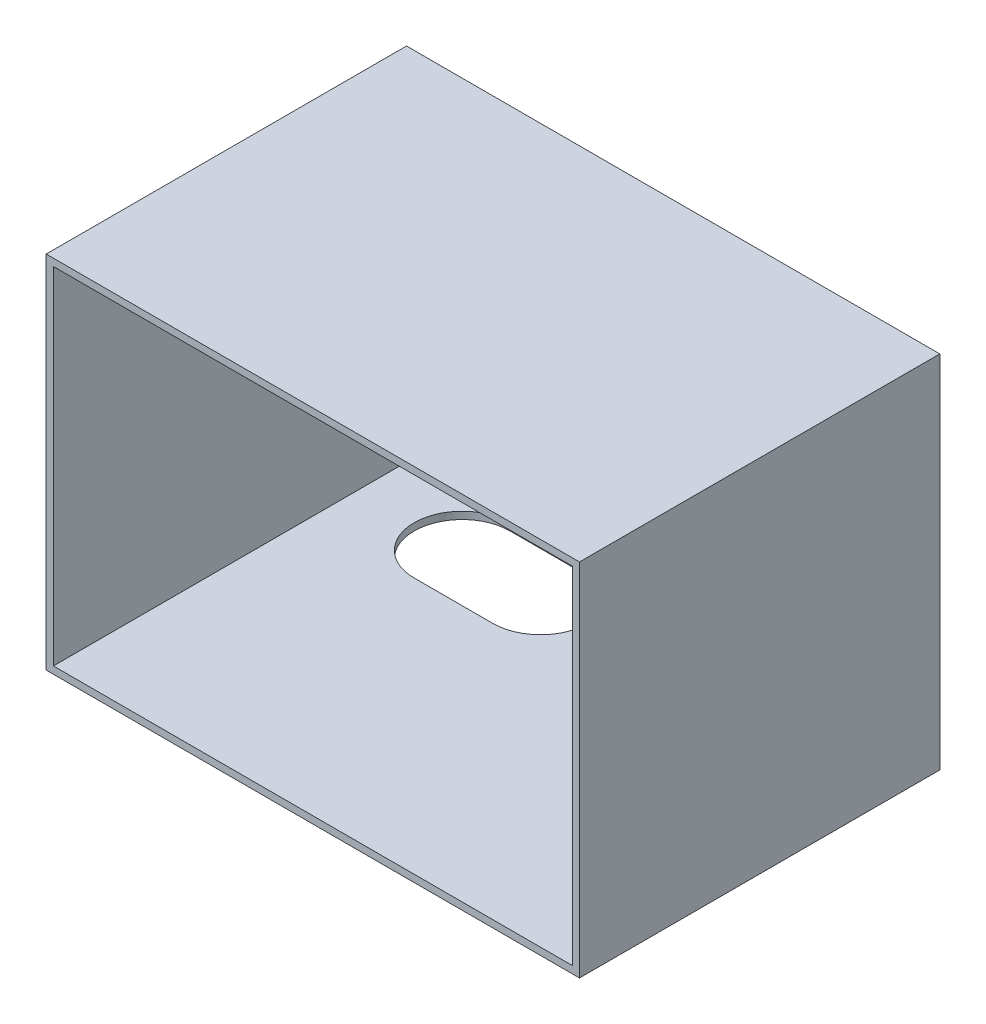
ISO-10303-21;
HEADER;
FILE_DESCRIPTION(('STEP AP214'),'2;1');
FILE_NAME('part.step','',(''),(''),'','','');
FILE_SCHEMA(('AUTOMOTIVE_DESIGN { 1 0 10303 214 1 1 1 1 }'));
ENDSEC;
DATA;
#1=APPLICATION_CONTEXT('core data for automotive mechanical design processes');
#2=APPLICATION_PROTOCOL_DEFINITION('international standard','automotive_design',2000,#1);
#3=PRODUCT_CONTEXT('',#1,'mechanical');
#4=PRODUCT('Part','Part','',(#3));
#5=PRODUCT_RELATED_PRODUCT_CATEGORY('part','',(#4));
#6=PRODUCT_DEFINITION_FORMATION('','',#4);
#7=PRODUCT_DEFINITION_CONTEXT('part definition',#1,'design');
#8=PRODUCT_DEFINITION('design','',#6,#7);
#9=PRODUCT_DEFINITION_SHAPE('','',#8);
#10=(LENGTH_UNIT() NAMED_UNIT(*) SI_UNIT(.MILLI.,.METRE.));
#11=(NAMED_UNIT(*) PLANE_ANGLE_UNIT() SI_UNIT($,.RADIAN.));
#12=(NAMED_UNIT(*) SI_UNIT($,.STERADIAN.) SOLID_ANGLE_UNIT());
#13=UNCERTAINTY_MEASURE_WITH_UNIT(LENGTH_MEASURE(1.E-05),#10,'distance_accuracy_value','');
#14=(GEOMETRIC_REPRESENTATION_CONTEXT(3) GLOBAL_UNCERTAINTY_ASSIGNED_CONTEXT((#13)) GLOBAL_UNIT_ASSIGNED_CONTEXT((#10,
#11,#12)) REPRESENTATION_CONTEXT('',''));
#15=CARTESIAN_POINT('',(0.,0.,0.));
#16=DIRECTION('',(0.,0.,1.));
#17=DIRECTION('',(1.,0.,0.));
#18=AXIS2_PLACEMENT_3D('',#15,#16,#17);
#19=CARTESIAN_POINT('',(0.,0.,27.94));
#20=DIRECTION('',(0.,0.,-1.));
#21=DIRECTION('',(-1.,0.,0.));
#22=AXIS2_PLACEMENT_3D('',#19,#20,#21);
#23=PLANE('',#22);
#24=DIRECTION('',(0.334823868747726,-0.94228073147911,0.));
#25=VECTOR('',#24,1.);
#26=CARTESIAN_POINT('',(162.94316431674,27.9524003357958,27.94));
#27=LINE('',#26,#25);
#28=CARTESIAN_POINT('',(162.94316431674,27.9524003357958,27.94));
#29=VERTEX_POINT('',#28);
#30=CARTESIAN_POINT('',(171.973040350861,2.54,27.94));
#31=VERTEX_POINT('',#30);
#32=EDGE_CURVE('E205',#29,#31,#27,.T.);
#33=ORIENTED_EDGE('',*,*,#32,.F.);
#34=DIRECTION('',(1.,0.,0.));
#35=VECTOR('',#34,1.);
#36=CARTESIAN_POINT('',(139.124135968123,27.9524003357958,27.94));
#37=LINE('',#36,#35);
#38=CARTESIAN_POINT('',(139.124135968123,27.9524003357958,27.94));
#39=VERTEX_POINT('',#38);
#40=EDGE_CURVE('E198',#39,#29,#37,.T.);
#41=ORIENTED_EDGE('',*,*,#40,.F.);
#42=DIRECTION('',(0.328856891569524,0.944379767290273,0.));
#43=VECTOR('',#42,1.);
#44=CARTESIAN_POINT('',(130.274896211823,2.54,27.94));
#45=LINE('',#44,#43);
#46=CARTESIAN_POINT('',(130.274896211823,2.54,27.94));
#47=VERTEX_POINT('',#46);
#48=EDGE_CURVE('E201',#47,#39,#45,.T.);
#49=ORIENTED_EDGE('',*,*,#48,.F.);
#50=DIRECTION('',(1.,0.,0.));
#51=VECTOR('',#50,1.);
#52=CARTESIAN_POINT('',(2.54,2.54,27.94));
#53=LINE('',#52,#51);
#54=EDGE_CURVE('E254',#47,#31,#53,.T.);
#55=ORIENTED_EDGE('',*,*,#54,.T.);
#56=EDGE_LOOP('',(#33,#41,#49,#55));
#57=FACE_BOUND('',#56,.T.);
#58=ADVANCED_FACE('F35',(#57),#23,.F.);
#59=CARTESIAN_POINT('',(0.,0.,127.));
#60=DIRECTION('',(1.,0.,0.));
#61=DIRECTION('',(0.,0.,-1.));
#62=AXIS2_PLACEMENT_3D('',#59,#60,#61);
#63=PLANE('',#62);
#64=DIRECTION('',(0.,-1.,0.));
#65=VECTOR('',#64,1.);
#66=CARTESIAN_POINT('',(0.,0.,0.));
#67=LINE('',#66,#65);
#68=CARTESIAN_POINT('',(0.,127.,0.));
#69=VERTEX_POINT('',#68);
#70=CARTESIAN_POINT('',(0.,0.,0.));
#71=VERTEX_POINT('',#70);
#72=EDGE_CURVE('E291',#69,#71,#67,.T.);
#73=ORIENTED_EDGE('',*,*,#72,.T.);
#74=DIRECTION('',(0.,0.,-1.));
#75=VECTOR('',#74,1.);
#76=CARTESIAN_POINT('',(0.,0.,127.));
#77=LINE('',#76,#75);
#78=CARTESIAN_POINT('',(0.,0.,127.));
#79=VERTEX_POINT('',#78);
#80=EDGE_CURVE('E326',#79,#71,#77,.T.);
#81=ORIENTED_EDGE('',*,*,#80,.F.);
#82=DIRECTION('',(0.,-1.,0.));
#83=VECTOR('',#82,1.);
#84=CARTESIAN_POINT('',(0.,0.,127.));
#85=LINE('',#84,#83);
#86=CARTESIAN_POINT('',(0.,127.,127.));
#87=VERTEX_POINT('',#86);
#88=EDGE_CURVE('E298',#87,#79,#85,.T.);
#89=ORIENTED_EDGE('',*,*,#88,.F.);
#90=DIRECTION('',(0.,0.,-1.));
#91=VECTOR('',#90,1.);
#92=CARTESIAN_POINT('',(0.,127.,127.));
#93=LINE('',#92,#91);
#94=EDGE_CURVE('E308',#87,#69,#93,.T.);
#95=ORIENTED_EDGE('',*,*,#94,.T.);
#96=EDGE_LOOP('',(#73,#81,#89,#95));
#97=FACE_BOUND('',#96,.T.);
#98=ADVANCED_FACE('F37',(#97),#63,.F.);
#99=CARTESIAN_POINT('',(0.,0.,127.));
#100=DIRECTION('',(0.,1.,0.));
#101=DIRECTION('',(0.,0.,1.));
#102=AXIS2_PLACEMENT_3D('',#99,#100,#101);
#103=PLANE('',#102);
#104=DIRECTION('',(1.,0.,0.));
#105=VECTOR('',#104,1.);
#106=CARTESIAN_POINT('',(39.2818426541862,0.,2.794));
#107=LINE('',#106,#105);
#108=CARTESIAN_POINT('',(39.2818426541862,0.,2.794));
#109=VERTEX_POINT('',#108);
#110=CARTESIAN_POINT('',(66.929,0.,2.794));
#111=VERTEX_POINT('',#110);
#112=EDGE_CURVE('E184',#109,#111,#107,.T.);
#113=ORIENTED_EDGE('',*,*,#112,.F.);
#114=CARTESIAN_POINT('',(39.2818426541862,0.,19.685));
#115=DIRECTION('',(0.,-1.,0.));
#116=DIRECTION('',(0.,0.,-1.));
#117=AXIS2_PLACEMENT_3D('',#114,#115,#116);
#118=CIRCLE('',#117,16.891);
#119=CARTESIAN_POINT('',(39.2818426541862,0.,36.576));
#120=VERTEX_POINT('',#119);
#121=EDGE_CURVE('E50',#120,#109,#118,.T.);
#122=ORIENTED_EDGE('',*,*,#121,.F.);
#123=DIRECTION('',(-1.,0.,0.));
#124=VECTOR('',#123,1.);
#125=CARTESIAN_POINT('',(39.2818426541862,0.,36.576));
#126=LINE('',#125,#124);
#127=CARTESIAN_POINT('',(66.929,0.,36.576));
#128=VERTEX_POINT('',#127);
#129=EDGE_CURVE('E191',#128,#120,#126,.T.);
#130=ORIENTED_EDGE('',*,*,#129,.F.);
#131=CARTESIAN_POINT('',(66.929,0.,19.685));
#132=DIRECTION('',(0.,-1.,0.));
#133=DIRECTION('',(0.,0.,-1.));
#134=AXIS2_PLACEMENT_3D('',#131,#132,#133);
#135=CIRCLE('',#134,16.891);
#136=EDGE_CURVE('E175',#111,#128,#135,.T.);
#137=ORIENTED_EDGE('',*,*,#136,.F.);
#138=EDGE_LOOP('',(#113,#122,#130,#137));
#139=FACE_BOUND('',#138,.T.);
#140=DIRECTION('',(-1.,0.,0.));
#141=VECTOR('',#140,1.);
#142=CARTESIAN_POINT('',(170.18,0.,25.4));
#143=LINE('',#142,#141);
#144=CARTESIAN_POINT('',(170.18,0.,25.4));
#145=VERTEX_POINT('',#144);
#146=CARTESIAN_POINT('',(132.08,0.,25.4));
#147=VERTEX_POINT('',#146);
#148=EDGE_CURVE('E272',#145,#147,#143,.T.);
#149=ORIENTED_EDGE('',*,*,#148,.F.);
#150=DIRECTION('',(0.,0.,-1.));
#151=VECTOR('',#150,1.);
#152=CARTESIAN_POINT('',(170.18,0.,25.4));
#153=LINE('',#152,#151);
#154=CARTESIAN_POINT('',(170.18,0.,0.));
#155=VERTEX_POINT('',#154);
#156=EDGE_CURVE('E282',#145,#155,#153,.T.);
#157=ORIENTED_EDGE('',*,*,#156,.T.);
#158=DIRECTION('',(1.,0.,0.));
#159=VECTOR('',#158,1.);
#160=CARTESIAN_POINT('',(0.,0.,0.));
#161=LINE('',#160,#159);
#162=CARTESIAN_POINT('',(187.96,0.,0.));
#163=VERTEX_POINT('',#162);
#164=EDGE_CURVE('E311',#155,#163,#161,.T.);
#165=ORIENTED_EDGE('',*,*,#164,.T.);
#166=DIRECTION('',(0.,0.,-1.));
#167=VECTOR('',#166,1.);
#168=CARTESIAN_POINT('',(187.96,0.,127.));
#169=LINE('',#168,#167);
#170=CARTESIAN_POINT('',(187.96,0.,127.));
#171=VERTEX_POINT('',#170);
#172=EDGE_CURVE('E323',#171,#163,#169,.T.);
#173=ORIENTED_EDGE('',*,*,#172,.F.);
#174=DIRECTION('',(1.,0.,0.));
#175=VECTOR('',#174,1.);
#176=CARTESIAN_POINT('',(0.,0.,127.));
#177=LINE('',#176,#175);
#178=EDGE_CURVE('E301',#79,#171,#177,.T.);
#179=ORIENTED_EDGE('',*,*,#178,.F.);
#180=ORIENTED_EDGE('',*,*,#80,.T.);
#181=CARTESIAN_POINT('',(132.08,0.,0.));
#182=VERTEX_POINT('',#181);
#183=EDGE_CURVE('E312',#71,#182,#161,.T.);
#184=ORIENTED_EDGE('',*,*,#183,.T.);
#185=DIRECTION('',(0.,0.,-1.));
#186=VECTOR('',#185,1.);
#187=CARTESIAN_POINT('',(132.08,0.,25.4));
#188=LINE('',#187,#186);
#189=EDGE_CURVE('E294',#147,#182,#188,.T.);
#190=ORIENTED_EDGE('',*,*,#189,.F.);
#191=EDGE_LOOP('',(#149,#157,#165,#173,#179,#180,#184,#190));
#192=FACE_BOUND('',#191,.T.);
#193=ADVANCED_FACE('F188',(#139,#192),#103,.F.);
#194=CARTESIAN_POINT('',(187.96,0.,127.));
#195=DIRECTION('',(-1.,0.,0.));
#196=DIRECTION('',(0.,0.,1.));
#197=AXIS2_PLACEMENT_3D('',#194,#195,#196);
#198=PLANE('',#197);
#199=DIRECTION('',(0.,1.,0.));
#200=VECTOR('',#199,1.);
#201=CARTESIAN_POINT('',(187.96,0.,0.));
#202=LINE('',#201,#200);
#203=CARTESIAN_POINT('',(187.96,127.,0.));
#204=VERTEX_POINT('',#203);
#205=EDGE_CURVE('E315',#163,#204,#202,.T.);
#206=ORIENTED_EDGE('',*,*,#205,.T.);
#207=DIRECTION('',(0.,0.,-1.));
#208=VECTOR('',#207,1.);
#209=CARTESIAN_POINT('',(187.96,127.,127.));
#210=LINE('',#209,#208);
#211=CARTESIAN_POINT('',(187.96,127.,127.));
#212=VERTEX_POINT('',#211);
#213=EDGE_CURVE('E320',#212,#204,#210,.T.);
#214=ORIENTED_EDGE('',*,*,#213,.F.);
#215=DIRECTION('',(0.,1.,0.));
#216=VECTOR('',#215,1.);
#217=CARTESIAN_POINT('',(187.96,0.,127.));
#218=LINE('',#217,#216);
#219=EDGE_CURVE('E304',#171,#212,#218,.T.);
#220=ORIENTED_EDGE('',*,*,#219,.F.);
#221=ORIENTED_EDGE('',*,*,#172,.T.);
#222=EDGE_LOOP('',(#206,#214,#220,#221));
#223=FACE_BOUND('',#222,.T.);
#224=ADVANCED_FACE('F397',(#223),#198,.F.);
#225=CARTESIAN_POINT('',(0.,127.,127.));
#226=DIRECTION('',(0.,-1.,0.));
#227=DIRECTION('',(0.,0.,-1.));
#228=AXIS2_PLACEMENT_3D('',#225,#226,#227);
#229=PLANE('',#228);
#230=DIRECTION('',(-1.,0.,0.));
#231=VECTOR('',#230,1.);
#232=CARTESIAN_POINT('',(0.,127.,0.));
#233=LINE('',#232,#231);
#234=EDGE_CURVE('E302',#204,#69,#233,.T.);
#235=ORIENTED_EDGE('',*,*,#234,.T.);
#236=ORIENTED_EDGE('',*,*,#94,.F.);
#237=DIRECTION('',(-1.,0.,0.));
#238=VECTOR('',#237,1.);
#239=CARTESIAN_POINT('',(0.,127.,127.));
#240=LINE('',#239,#238);
#241=EDGE_CURVE('E306',#212,#87,#240,.T.);
#242=ORIENTED_EDGE('',*,*,#241,.F.);
#243=ORIENTED_EDGE('',*,*,#213,.T.);
#244=EDGE_LOOP('',(#235,#236,#242,#243));
#245=FACE_BOUND('',#244,.T.);
#246=ADVANCED_FACE('F390',(#245),#229,.F.);
#247=CARTESIAN_POINT('',(0.,0.,127.));
#248=DIRECTION('',(0.,0.,-1.));
#249=DIRECTION('',(-1.,0.,0.));
#250=AXIS2_PLACEMENT_3D('',#247,#248,#249);
#251=PLANE('',#250);
#252=DIRECTION('',(-1.,0.,0.));
#253=VECTOR('',#252,1.);
#254=CARTESIAN_POINT('',(185.42,124.46,127.));
#255=LINE('',#254,#253);
#256=CARTESIAN_POINT('',(185.42,124.46,127.));
#257=VERTEX_POINT('',#256);
#258=CARTESIAN_POINT('',(2.54,124.46,127.));
#259=VERTEX_POINT('',#258);
#260=EDGE_CURVE('E245',#257,#259,#255,.T.);
#261=ORIENTED_EDGE('',*,*,#260,.F.);
#262=DIRECTION('',(0.,1.,0.));
#263=VECTOR('',#262,1.);
#264=CARTESIAN_POINT('',(185.42,2.54,127.));
#265=LINE('',#264,#263);
#266=CARTESIAN_POINT('',(185.42,2.54,127.));
#267=VERTEX_POINT('',#266);
#268=EDGE_CURVE('E248',#267,#257,#265,.T.);
#269=ORIENTED_EDGE('',*,*,#268,.F.);
#270=DIRECTION('',(1.,0.,0.));
#271=VECTOR('',#270,1.);
#272=CARTESIAN_POINT('',(2.54,2.54,127.));
#273=LINE('',#272,#271);
#274=CARTESIAN_POINT('',(2.54,2.54,127.));
#275=VERTEX_POINT('',#274);
#276=EDGE_CURVE('E251',#275,#267,#273,.T.);
#277=ORIENTED_EDGE('',*,*,#276,.F.);
#278=DIRECTION('',(0.,-1.,0.));
#279=VECTOR('',#278,1.);
#280=CARTESIAN_POINT('',(2.54,124.46,127.));
#281=LINE('',#280,#279);
#282=EDGE_CURVE('E242',#259,#275,#281,.T.);
#283=ORIENTED_EDGE('',*,*,#282,.F.);
#284=EDGE_LOOP('',(#261,#269,#277,#283));
#285=FACE_BOUND('',#284,.T.);
#286=ORIENTED_EDGE('',*,*,#88,.T.);
#287=ORIENTED_EDGE('',*,*,#178,.T.);
#288=ORIENTED_EDGE('',*,*,#219,.T.);
#289=ORIENTED_EDGE('',*,*,#241,.T.);
#290=EDGE_LOOP('',(#286,#287,#288,#289));
#291=FACE_BOUND('',#290,.T.);
#292=ADVANCED_FACE('F387',(#285,#291),#251,.F.);
#293=CARTESIAN_POINT('',(0.,0.,0.));
#294=DIRECTION('',(0.,0.,-1.));
#295=DIRECTION('',(-1.,0.,0.));
#296=AXIS2_PLACEMENT_3D('',#293,#294,#295);
#297=PLANE('',#296);
#298=DIRECTION('',(0.334823868747726,-0.94228073147911,0.));
#299=VECTOR('',#298,1.);
#300=CARTESIAN_POINT('',(161.150123965879,25.4124003357958,0.));
#301=LINE('',#300,#299);
#302=CARTESIAN_POINT('',(161.150123965879,25.4124003357958,0.));
#303=VERTEX_POINT('',#302);
#304=EDGE_CURVE('E268',#303,#155,#301,.T.);
#305=ORIENTED_EDGE('',*,*,#304,.F.);
#306=DIRECTION('',(1.,0.,0.));
#307=VECTOR('',#306,1.);
#308=CARTESIAN_POINT('',(140.9292397563,25.4124003357958,0.));
#309=LINE('',#308,#307);
#310=CARTESIAN_POINT('',(140.9292397563,25.4124003357958,0.));
#311=VERTEX_POINT('',#310);
#312=EDGE_CURVE('E273',#311,#303,#309,.T.);
#313=ORIENTED_EDGE('',*,*,#312,.F.);
#314=DIRECTION('',(0.328856891569524,0.944379767290273,0.));
#315=VECTOR('',#314,1.);
#316=CARTESIAN_POINT('',(140.9292397563,25.4124003357958,0.));
#317=LINE('',#316,#315);
#318=EDGE_CURVE('E284',#182,#311,#317,.T.);
#319=ORIENTED_EDGE('',*,*,#318,.F.);
#320=ORIENTED_EDGE('',*,*,#183,.F.);
#321=ORIENTED_EDGE('',*,*,#72,.F.);
#322=ORIENTED_EDGE('',*,*,#234,.F.);
#323=ORIENTED_EDGE('',*,*,#205,.F.);
#324=ORIENTED_EDGE('',*,*,#164,.F.);
#325=EDGE_LOOP('',(#305,#313,#319,#320,#321,#322,#323,#324));
#326=FACE_BOUND('',#325,.T.);
#327=ADVANCED_FACE('F385',(#326),#297,.T.);
#328=CARTESIAN_POINT('',(161.150123965879,25.4124003357958,25.4));
#329=DIRECTION('',(0.94228073147911,0.334823868747726,0.));
#330=DIRECTION('',(-0.334823868747726,0.94228073147911,0.));
#331=AXIS2_PLACEMENT_3D('',#328,#329,#330);
#332=PLANE('',#331);
#333=ORIENTED_EDGE('',*,*,#304,.T.);
#334=ORIENTED_EDGE('',*,*,#156,.F.);
#335=DIRECTION('',(0.334823868747726,-0.94228073147911,0.));
#336=VECTOR('',#335,1.);
#337=CARTESIAN_POINT('',(161.150123965879,25.4124003357958,25.4));
#338=LINE('',#337,#336);
#339=CARTESIAN_POINT('',(161.150123965879,25.4124003357958,25.4));
#340=VERTEX_POINT('',#339);
#341=EDGE_CURVE('E269',#340,#145,#338,.T.);
#342=ORIENTED_EDGE('',*,*,#341,.F.);
#343=DIRECTION('',(0.,0.,-1.));
#344=VECTOR('',#343,1.);
#345=CARTESIAN_POINT('',(161.150123965879,25.4124003357958,25.4));
#346=LINE('',#345,#344);
#347=EDGE_CURVE('E289',#340,#303,#346,.T.);
#348=ORIENTED_EDGE('',*,*,#347,.T.);
#349=EDGE_LOOP('',(#333,#334,#342,#348));
#350=FACE_BOUND('',#349,.T.);
#351=ADVANCED_FACE('F378',(#350),#332,.F.);
#352=CARTESIAN_POINT('',(140.9292397563,25.4124003357958,25.4));
#353=DIRECTION('',(0.,1.,0.));
#354=DIRECTION('',(0.,0.,1.));
#355=AXIS2_PLACEMENT_3D('',#352,#353,#354);
#356=PLANE('',#355);
#357=CARTESIAN_POINT('',(151.039681861089,25.4124003357958,7.39143381935942));
#358=DIRECTION('',(0.,-1.,0.));
#359=DIRECTION('',(0.,0.,-1.));
#360=AXIS2_PLACEMENT_3D('',#357,#358,#359);
#361=CIRCLE('',#360,4.699);
#362=CARTESIAN_POINT('',(151.039681861089,25.4124003357958,2.69243381935942));
#363=VERTEX_POINT('',#362);
#364=EDGE_CURVE('E265',#363,#363,#361,.T.);
#365=ORIENTED_EDGE('',*,*,#364,.F.);
#366=EDGE_LOOP('',(#365));
#367=FACE_BOUND('',#366,.T.);
#368=ORIENTED_EDGE('',*,*,#312,.T.);
#369=ORIENTED_EDGE('',*,*,#347,.F.);
#370=DIRECTION('',(1.,0.,0.));
#371=VECTOR('',#370,1.);
#372=CARTESIAN_POINT('',(140.9292397563,25.4124003357958,25.4));
#373=LINE('',#372,#371);
#374=CARTESIAN_POINT('',(140.9292397563,25.4124003357958,25.4));
#375=VERTEX_POINT('',#374);
#376=EDGE_CURVE('E279',#375,#340,#373,.T.);
#377=ORIENTED_EDGE('',*,*,#376,.F.);
#378=DIRECTION('',(0.,0.,-1.));
#379=VECTOR('',#378,1.);
#380=CARTESIAN_POINT('',(140.9292397563,25.4124003357958,25.4));
#381=LINE('',#380,#379);
#382=EDGE_CURVE('E292',#375,#311,#381,.T.);
#383=ORIENTED_EDGE('',*,*,#382,.T.);
#384=EDGE_LOOP('',(#368,#369,#377,#383));
#385=FACE_BOUND('',#384,.T.);
#386=ADVANCED_FACE('F375',(#367,#385),#356,.F.);
#387=CARTESIAN_POINT('',(140.9292397563,25.4124003357958,25.4));
#388=DIRECTION('',(-0.944379767290273,0.328856891569524,0.));
#389=DIRECTION('',(-0.328856891569524,-0.944379767290273,0.));
#390=AXIS2_PLACEMENT_3D('',#387,#388,#389);
#391=PLANE('',#390);
#392=ORIENTED_EDGE('',*,*,#318,.T.);
#393=ORIENTED_EDGE('',*,*,#382,.F.);
#394=DIRECTION('',(0.328856891569524,0.944379767290273,0.));
#395=VECTOR('',#394,1.);
#396=CARTESIAN_POINT('',(140.9292397563,25.4124003357958,25.4));
#397=LINE('',#396,#395);
#398=EDGE_CURVE('E276',#147,#375,#397,.T.);
#399=ORIENTED_EDGE('',*,*,#398,.F.);
#400=ORIENTED_EDGE('',*,*,#189,.T.);
#401=EDGE_LOOP('',(#392,#393,#399,#400));
#402=FACE_BOUND('',#401,.T.);
#403=ADVANCED_FACE('F373',(#402),#391,.F.);
#404=CARTESIAN_POINT('',(0.,0.,25.4));
#405=DIRECTION('',(0.,0.,-1.));
#406=DIRECTION('',(-1.,0.,0.));
#407=AXIS2_PLACEMENT_3D('',#404,#405,#406);
#408=PLANE('',#407);
#409=ORIENTED_EDGE('',*,*,#341,.T.);
#410=ORIENTED_EDGE('',*,*,#148,.T.);
#411=ORIENTED_EDGE('',*,*,#398,.T.);
#412=ORIENTED_EDGE('',*,*,#376,.T.);
#413=EDGE_LOOP('',(#409,#410,#411,#412));
#414=FACE_BOUND('',#413,.T.);
#415=ADVANCED_FACE('F369',(#414),#408,.T.);
#416=CARTESIAN_POINT('',(151.039681861089,38.1124003357958,7.39143381935942));
#417=DIRECTION('',(0.,-1.,0.));
#418=DIRECTION('',(0.,0.,-1.));
#419=AXIS2_PLACEMENT_3D('',#416,#417,#418);
#420=CYLINDRICAL_SURFACE('',#419,4.699);
#421=CARTESIAN_POINT('',(151.039681861089,27.9524003357958,7.39143381935942));
#422=DIRECTION('',(0.,-1.,0.));
#423=DIRECTION('',(0.,0.,-1.));
#424=AXIS2_PLACEMENT_3D('',#421,#422,#423);
#425=CIRCLE('',#424,4.699);
#426=CARTESIAN_POINT('',(151.039681861089,27.9524003357958,2.69243381935942));
#427=VERTEX_POINT('',#426);
#428=EDGE_CURVE('E241',#427,#427,#425,.F.);
#429=ORIENTED_EDGE('',*,*,#428,.T.);
#430=EDGE_LOOP('',(#429));
#431=FACE_BOUND('',#430,.T.);
#432=ORIENTED_EDGE('',*,*,#364,.T.);
#433=EDGE_LOOP('',(#432));
#434=FACE_BOUND('',#433,.T.);
#435=ADVANCED_FACE('F366',(#431,#434),#420,.F.);
#436=CARTESIAN_POINT('',(185.42,2.54,-194.394405752285));
#437=DIRECTION('',(1.,0.,0.));
#438=DIRECTION('',(0.,0.,-1.));
#439=AXIS2_PLACEMENT_3D('',#436,#437,#438);
#440=PLANE('',#439);
#441=DIRECTION('',(0.,0.,1.));
#442=VECTOR('',#441,1.);
#443=CARTESIAN_POINT('',(185.42,2.54,-194.394405752285));
#444=LINE('',#443,#442);
#445=CARTESIAN_POINT('',(185.42,2.54,2.53999999999999));
#446=VERTEX_POINT('',#445);
#447=EDGE_CURVE('E257',#446,#267,#444,.T.);
#448=ORIENTED_EDGE('',*,*,#447,.T.);
#449=ORIENTED_EDGE('',*,*,#268,.T.);
#450=DIRECTION('',(0.,0.,1.));
#451=VECTOR('',#450,1.);
#452=CARTESIAN_POINT('',(185.42,124.46,-194.394405752285));
#453=LINE('',#452,#451);
#454=CARTESIAN_POINT('',(185.42,124.46,2.53999999999999));
#455=VERTEX_POINT('',#454);
#456=EDGE_CURVE('E244',#455,#257,#453,.T.);
#457=ORIENTED_EDGE('',*,*,#456,.F.);
#458=DIRECTION('',(0.,1.,0.));
#459=VECTOR('',#458,1.);
#460=CARTESIAN_POINT('',(185.42,2.54,2.53999999999999));
#461=LINE('',#460,#459);
#462=EDGE_CURVE('E231',#446,#455,#461,.T.);
#463=ORIENTED_EDGE('',*,*,#462,.F.);
#464=EDGE_LOOP('',(#448,#449,#457,#463));
#465=FACE_BOUND('',#464,.T.);
#466=ADVANCED_FACE('F364',(#465),#440,.F.);
#467=CARTESIAN_POINT('',(185.42,124.46,-194.394405752285));
#468=DIRECTION('',(0.,1.,0.));
#469=DIRECTION('',(0.,0.,1.));
#470=AXIS2_PLACEMENT_3D('',#467,#468,#469);
#471=PLANE('',#470);
#472=ORIENTED_EDGE('',*,*,#456,.T.);
#473=ORIENTED_EDGE('',*,*,#260,.T.);
#474=DIRECTION('',(0.,0.,1.));
#475=VECTOR('',#474,1.);
#476=CARTESIAN_POINT('',(2.54,124.46,-194.394405752285));
#477=LINE('',#476,#475);
#478=CARTESIAN_POINT('',(2.54000000000001,124.46,2.53999999999999));
#479=VERTEX_POINT('',#478);
#480=EDGE_CURVE('E261',#479,#259,#477,.T.);
#481=ORIENTED_EDGE('',*,*,#480,.F.);
#482=DIRECTION('',(-1.,0.,0.));
#483=VECTOR('',#482,1.);
#484=CARTESIAN_POINT('',(185.42,124.46,2.53999999999999));
#485=LINE('',#484,#483);
#486=EDGE_CURVE('E228',#455,#479,#485,.T.);
#487=ORIENTED_EDGE('',*,*,#486,.F.);
#488=EDGE_LOOP('',(#472,#473,#481,#487));
#489=FACE_BOUND('',#488,.T.);
#490=ADVANCED_FACE('F450',(#489),#471,.F.);
#491=CARTESIAN_POINT('',(2.54,124.46,-194.394405752285));
#492=DIRECTION('',(-1.,0.,0.));
#493=DIRECTION('',(0.,0.,1.));
#494=AXIS2_PLACEMENT_3D('',#491,#492,#493);
#495=PLANE('',#494);
#496=ORIENTED_EDGE('',*,*,#480,.T.);
#497=ORIENTED_EDGE('',*,*,#282,.T.);
#498=DIRECTION('',(0.,0.,1.));
#499=VECTOR('',#498,1.);
#500=CARTESIAN_POINT('',(2.54,2.54,-194.394405752285));
#501=LINE('',#500,#499);
#502=CARTESIAN_POINT('',(2.54,2.54,2.53999999999999));
#503=VERTEX_POINT('',#502);
#504=EDGE_CURVE('E258',#503,#275,#501,.T.);
#505=ORIENTED_EDGE('',*,*,#504,.F.);
#506=DIRECTION('',(0.,-1.,0.));
#507=VECTOR('',#506,1.);
#508=CARTESIAN_POINT('',(2.54,124.46,2.53999999999999));
#509=LINE('',#508,#507);
#510=EDGE_CURVE('E225',#479,#503,#509,.T.);
#511=ORIENTED_EDGE('',*,*,#510,.F.);
#512=EDGE_LOOP('',(#496,#497,#505,#511));
#513=FACE_BOUND('',#512,.T.);
#514=ADVANCED_FACE('F457',(#513),#495,.F.);
#515=CARTESIAN_POINT('',(2.54,2.54,-194.394405752285));
#516=DIRECTION('',(0.,-1.,0.));
#517=DIRECTION('',(0.,0.,-1.));
#518=AXIS2_PLACEMENT_3D('',#515,#516,#517);
#519=PLANE('',#518);
#520=DIRECTION('',(-1.,0.,0.));
#521=VECTOR('',#520,1.);
#522=CARTESIAN_POINT('',(2.54,2.54,36.576));
#523=LINE('',#522,#521);
#524=CARTESIAN_POINT('',(66.929,2.54,36.576));
#525=VERTEX_POINT('',#524);
#526=CARTESIAN_POINT('',(39.2818426541862,2.54,36.576));
#527=VERTEX_POINT('',#526);
#528=EDGE_CURVE('E43',#525,#527,#523,.T.);
#529=ORIENTED_EDGE('',*,*,#528,.T.);
#530=CARTESIAN_POINT('',(39.2818426541862,2.54,19.685));
#531=DIRECTION('',(0.,-1.,0.));
#532=DIRECTION('',(0.,0.,-1.));
#533=AXIS2_PLACEMENT_3D('',#530,#531,#532);
#534=CIRCLE('',#533,16.891);
#535=CARTESIAN_POINT('',(39.2818426541862,2.54,2.794));
#536=VERTEX_POINT('',#535);
#537=EDGE_CURVE('E12',#527,#536,#534,.T.);
#538=ORIENTED_EDGE('',*,*,#537,.T.);
#539=DIRECTION('',(1.,0.,0.));
#540=VECTOR('',#539,1.);
#541=CARTESIAN_POINT('',(2.54,2.54,2.79400000000002));
#542=LINE('',#541,#540);
#543=CARTESIAN_POINT('',(66.929,2.54,2.79400000000002));
#544=VERTEX_POINT('',#543);
#545=EDGE_CURVE('E329',#536,#544,#542,.T.);
#546=ORIENTED_EDGE('',*,*,#545,.T.);
#547=CARTESIAN_POINT('',(66.929,2.54,19.685));
#548=DIRECTION('',(0.,-1.,0.));
#549=DIRECTION('',(0.,0.,-1.));
#550=AXIS2_PLACEMENT_3D('',#547,#548,#549);
#551=CIRCLE('',#550,16.891);
#552=EDGE_CURVE('E178',#544,#525,#551,.T.);
#553=ORIENTED_EDGE('',*,*,#552,.T.);
#554=EDGE_LOOP('',(#529,#538,#546,#553));
#555=FACE_BOUND('',#554,.T.);
#556=ORIENTED_EDGE('',*,*,#504,.T.);
#557=ORIENTED_EDGE('',*,*,#276,.T.);
#558=ORIENTED_EDGE('',*,*,#447,.F.);
#559=DIRECTION('',(1.,0.,0.));
#560=VECTOR('',#559,1.);
#561=CARTESIAN_POINT('',(171.973040350861,2.54,2.53999999999999));
#562=LINE('',#561,#560);
#563=CARTESIAN_POINT('',(171.973040350861,2.54,2.53999999999999));
#564=VERTEX_POINT('',#563);
#565=EDGE_CURVE('E234',#564,#446,#562,.T.);
#566=ORIENTED_EDGE('',*,*,#565,.F.);
#567=DIRECTION('',(0.,0.,1.));
#568=VECTOR('',#567,1.);
#569=CARTESIAN_POINT('',(171.973040350861,2.54,-219.794405752285));
#570=LINE('',#569,#568);
#571=EDGE_CURVE('E212',#564,#31,#570,.T.);
#572=ORIENTED_EDGE('',*,*,#571,.T.);
#573=ORIENTED_EDGE('',*,*,#54,.F.);
#574=DIRECTION('',(0.,0.,1.));
#575=VECTOR('',#574,1.);
#576=CARTESIAN_POINT('',(130.274896211823,2.54,-219.794405752285));
#577=LINE('',#576,#575);
#578=CARTESIAN_POINT('',(130.274896211823,2.54,2.53999999999999));
#579=VERTEX_POINT('',#578);
#580=EDGE_CURVE('E221',#579,#47,#577,.T.);
#581=ORIENTED_EDGE('',*,*,#580,.F.);
#582=DIRECTION('',(1.,0.,0.));
#583=VECTOR('',#582,1.);
#584=CARTESIAN_POINT('',(2.54,2.54,2.53999999999999));
#585=LINE('',#584,#583);
#586=EDGE_CURVE('E222',#503,#579,#585,.T.);
#587=ORIENTED_EDGE('',*,*,#586,.F.);
#588=EDGE_LOOP('',(#556,#557,#558,#566,#572,#573,#581,#587));
#589=FACE_BOUND('',#588,.T.);
#590=ADVANCED_FACE('F335',(#555,#589),#519,.F.);
#591=CARTESIAN_POINT('',(139.124135968123,27.9524003357958,-219.794405752285));
#592=DIRECTION('',(0.,-1.,0.));
#593=DIRECTION('',(0.,0.,-1.));
#594=AXIS2_PLACEMENT_3D('',#591,#592,#593);
#595=PLANE('',#594);
#596=DIRECTION('',(0.,0.,1.));
#597=VECTOR('',#596,1.);
#598=CARTESIAN_POINT('',(139.124135968123,27.9524003357958,-219.794405752285));
#599=LINE('',#598,#597);
#600=CARTESIAN_POINT('',(139.124135968123,27.9524003357958,2.53999999999999));
#601=VERTEX_POINT('',#600);
#602=EDGE_CURVE('E217',#601,#39,#599,.T.);
#603=ORIENTED_EDGE('',*,*,#602,.T.);
#604=ORIENTED_EDGE('',*,*,#40,.T.);
#605=DIRECTION('',(0.,0.,1.));
#606=VECTOR('',#605,1.);
#607=CARTESIAN_POINT('',(162.94316431674,27.9524003357958,-219.794405752285));
#608=LINE('',#607,#606);
#609=CARTESIAN_POINT('',(162.94316431674,27.9524003357958,2.53999999999999));
#610=VERTEX_POINT('',#609);
#611=EDGE_CURVE('E216',#610,#29,#608,.T.);
#612=ORIENTED_EDGE('',*,*,#611,.F.);
#613=DIRECTION('',(1.,0.,0.));
#614=VECTOR('',#613,1.);
#615=CARTESIAN_POINT('',(139.124135968123,27.9524003357958,2.53999999999999));
#616=LINE('',#615,#614);
#617=EDGE_CURVE('E213',#601,#610,#616,.T.);
#618=ORIENTED_EDGE('',*,*,#617,.F.);
#619=EDGE_LOOP('',(#603,#604,#612,#618));
#620=FACE_BOUND('',#619,.T.);
#621=ORIENTED_EDGE('',*,*,#428,.F.);
#622=EDGE_LOOP('',(#621));
#623=FACE_BOUND('',#622,.T.);
#624=ADVANCED_FACE('F471',(#620,#623),#595,.F.);
#625=CARTESIAN_POINT('',(0.,0.,2.54));
#626=DIRECTION('',(0.,0.,-1.));
#627=DIRECTION('',(-1.,0.,0.));
#628=AXIS2_PLACEMENT_3D('',#625,#626,#627);
#629=PLANE('',#628);
#630=ORIENTED_EDGE('',*,*,#617,.T.);
#631=DIRECTION('',(0.334823868747726,-0.94228073147911,0.));
#632=VECTOR('',#631,1.);
#633=CARTESIAN_POINT('',(162.94316431674,27.9524003357958,2.53999999999999));
#634=LINE('',#633,#632);
#635=EDGE_CURVE('E204',#610,#564,#634,.T.);
#636=ORIENTED_EDGE('',*,*,#635,.T.);
#637=ORIENTED_EDGE('',*,*,#565,.T.);
#638=ORIENTED_EDGE('',*,*,#462,.T.);
#639=ORIENTED_EDGE('',*,*,#486,.T.);
#640=ORIENTED_EDGE('',*,*,#510,.T.);
#641=ORIENTED_EDGE('',*,*,#586,.T.);
#642=DIRECTION('',(0.328856891569524,0.944379767290273,0.));
#643=VECTOR('',#642,1.);
#644=CARTESIAN_POINT('',(130.274896211823,2.54,2.53999999999999));
#645=LINE('',#644,#643);
#646=EDGE_CURVE('E218',#579,#601,#645,.T.);
#647=ORIENTED_EDGE('',*,*,#646,.T.);
#648=EDGE_LOOP('',(#630,#636,#637,#638,#639,#640,#641,#647));
#649=FACE_BOUND('',#648,.T.);
#650=ADVANCED_FACE('F477',(#649),#629,.F.);
#651=CARTESIAN_POINT('',(162.94316431674,27.9524003357958,-219.794405752285));
#652=DIRECTION('',(-0.94228073147911,-0.334823868747726,0.));
#653=DIRECTION('',(0.334823868747726,-0.94228073147911,0.));
#654=AXIS2_PLACEMENT_3D('',#651,#652,#653);
#655=PLANE('',#654);
#656=ORIENTED_EDGE('',*,*,#611,.T.);
#657=ORIENTED_EDGE('',*,*,#32,.T.);
#658=ORIENTED_EDGE('',*,*,#571,.F.);
#659=ORIENTED_EDGE('',*,*,#635,.F.);
#660=EDGE_LOOP('',(#656,#657,#658,#659));
#661=FACE_BOUND('',#660,.T.);
#662=ADVANCED_FACE('F349',(#661),#655,.F.);
#663=CARTESIAN_POINT('',(130.274896211823,2.54,-219.794405752285));
#664=DIRECTION('',(0.944379767290273,-0.328856891569524,0.));
#665=DIRECTION('',(0.328856891569524,0.944379767290273,0.));
#666=AXIS2_PLACEMENT_3D('',#663,#664,#665);
#667=PLANE('',#666);
#668=ORIENTED_EDGE('',*,*,#580,.T.);
#669=ORIENTED_EDGE('',*,*,#48,.T.);
#670=ORIENTED_EDGE('',*,*,#602,.F.);
#671=ORIENTED_EDGE('',*,*,#646,.F.);
#672=EDGE_LOOP('',(#668,#669,#670,#671));
#673=FACE_BOUND('',#672,.T.);
#674=ADVANCED_FACE('F342',(#673),#667,.F.);
#675=CARTESIAN_POINT('',(39.2818426541862,3.048,19.685));
#676=DIRECTION('',(0.,-1.,0.));
#677=DIRECTION('',(0.,0.,-1.));
#678=AXIS2_PLACEMENT_3D('',#675,#676,#677);
#679=CYLINDRICAL_SURFACE('',#678,16.891);
#680=DIRECTION('',(0.,-1.,0.));
#681=VECTOR('',#680,1.);
#682=CARTESIAN_POINT('',(39.2818426541862,3.048,36.576));
#683=LINE('',#682,#681);
#684=EDGE_CURVE('E196',#527,#120,#683,.T.);
#685=ORIENTED_EDGE('',*,*,#684,.T.);
#686=ORIENTED_EDGE('',*,*,#121,.T.);
#687=DIRECTION('',(0.,-1.,0.));
#688=VECTOR('',#687,1.);
#689=CARTESIAN_POINT('',(39.2818426541862,3.048,2.794));
#690=LINE('',#689,#688);
#691=EDGE_CURVE('E181',#536,#109,#690,.T.);
#692=ORIENTED_EDGE('',*,*,#691,.F.);
#693=ORIENTED_EDGE('',*,*,#537,.F.);
#694=EDGE_LOOP('',(#685,#686,#692,#693));
#695=FACE_BOUND('',#694,.T.);
#696=ADVANCED_FACE('F340',(#695),#679,.F.);
#697=CARTESIAN_POINT('',(39.2818426541862,3.048,36.576));
#698=DIRECTION('',(0.,0.,1.));
#699=DIRECTION('',(1.,0.,0.));
#700=AXIS2_PLACEMENT_3D('',#697,#698,#699);
#701=PLANE('',#700);
#702=DIRECTION('',(0.,-1.,0.));
#703=VECTOR('',#702,1.);
#704=CARTESIAN_POINT('',(66.929,3.048,36.576));
#705=LINE('',#704,#703);
#706=EDGE_CURVE('E180',#525,#128,#705,.T.);
#707=ORIENTED_EDGE('',*,*,#706,.T.);
#708=ORIENTED_EDGE('',*,*,#129,.T.);
#709=ORIENTED_EDGE('',*,*,#684,.F.);
#710=ORIENTED_EDGE('',*,*,#528,.F.);
#711=EDGE_LOOP('',(#707,#708,#709,#710));
#712=FACE_BOUND('',#711,.T.);
#713=ADVANCED_FACE('F339',(#712),#701,.F.);
#714=CARTESIAN_POINT('',(66.929,3.048,19.685));
#715=DIRECTION('',(0.,-1.,0.));
#716=DIRECTION('',(0.,0.,-1.));
#717=AXIS2_PLACEMENT_3D('',#714,#715,#716);
#718=CYLINDRICAL_SURFACE('',#717,16.891);
#719=DIRECTION('',(0.,-1.,0.));
#720=VECTOR('',#719,1.);
#721=CARTESIAN_POINT('',(66.929,3.048,2.794));
#722=LINE('',#721,#720);
#723=EDGE_CURVE('E58',#544,#111,#722,.T.);
#724=ORIENTED_EDGE('',*,*,#723,.T.);
#725=ORIENTED_EDGE('',*,*,#136,.T.);
#726=ORIENTED_EDGE('',*,*,#706,.F.);
#727=ORIENTED_EDGE('',*,*,#552,.F.);
#728=EDGE_LOOP('',(#724,#725,#726,#727));
#729=FACE_BOUND('',#728,.T.);
#730=ADVANCED_FACE('F172',(#729),#718,.F.);
#731=CARTESIAN_POINT('',(39.2818426541862,3.048,2.794));
#732=DIRECTION('',(0.,0.,-1.));
#733=DIRECTION('',(-1.,0.,0.));
#734=AXIS2_PLACEMENT_3D('',#731,#732,#733);
#735=PLANE('',#734);
#736=ORIENTED_EDGE('',*,*,#691,.T.);
#737=ORIENTED_EDGE('',*,*,#112,.T.);
#738=ORIENTED_EDGE('',*,*,#723,.F.);
#739=ORIENTED_EDGE('',*,*,#545,.F.);
#740=EDGE_LOOP('',(#736,#737,#738,#739));
#741=FACE_BOUND('',#740,.T.);
#742=ADVANCED_FACE('F185',(#741),#735,.F.);
#743=CLOSED_SHELL('',(#58,#98,#193,#224,#246,#292,#327,#351,#386,#403,#415,#435,#466,#490,#514,
#590,#624,#650,#662,#674,#696,#713,#730,#742));
#744=MANIFOLD_SOLID_BREP('B2',#743);
#745=ADVANCED_BREP_SHAPE_REPRESENTATION('',(#18,#744),#14);
#746=SHAPE_DEFINITION_REPRESENTATION(#9,#745);
ENDSEC;
END-ISO-10303-21;
